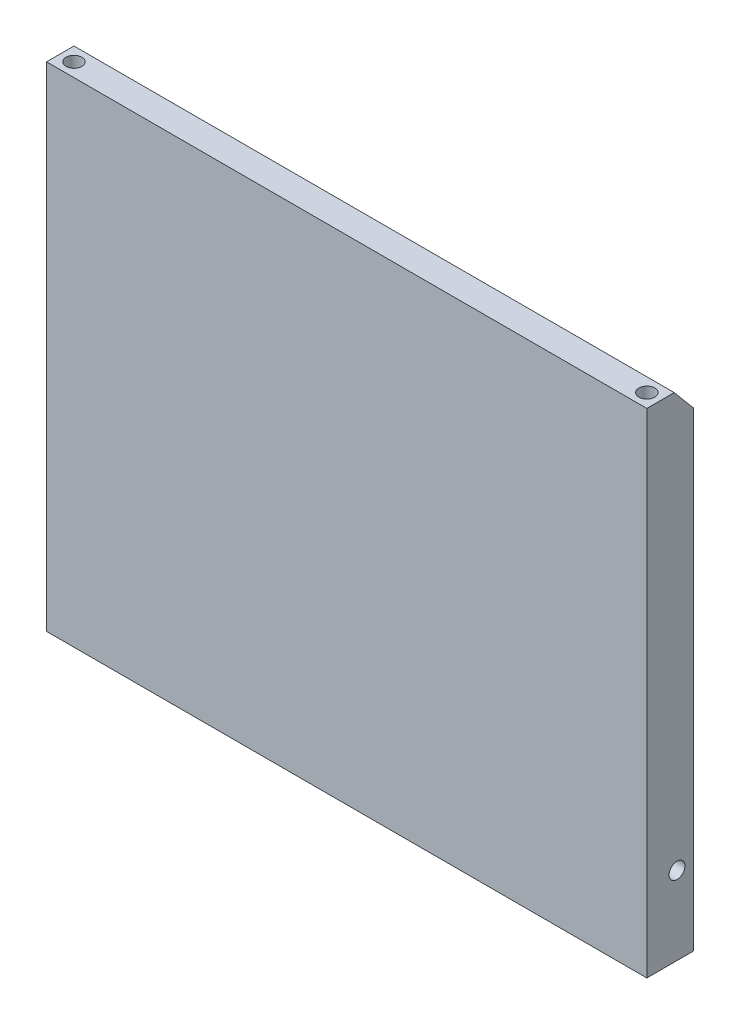
ISO-10303-21;
HEADER;
FILE_DESCRIPTION(('STEP AP214'),'2;1');
FILE_NAME('part.step','',(''),(''),'','','');
FILE_SCHEMA(('AUTOMOTIVE_DESIGN { 1 0 10303 214 1 1 1 1 }'));
ENDSEC;
DATA;
#1=APPLICATION_CONTEXT('core data for automotive mechanical design processes');
#2=APPLICATION_PROTOCOL_DEFINITION('international standard','automotive_design',2000,#1);
#3=PRODUCT_CONTEXT('',#1,'mechanical');
#4=PRODUCT('Part','Part','',(#3));
#5=PRODUCT_RELATED_PRODUCT_CATEGORY('part','',(#4));
#6=PRODUCT_DEFINITION_FORMATION('','',#4);
#7=PRODUCT_DEFINITION_CONTEXT('part definition',#1,'design');
#8=PRODUCT_DEFINITION('design','',#6,#7);
#9=PRODUCT_DEFINITION_SHAPE('','',#8);
#10=(LENGTH_UNIT() NAMED_UNIT(*) SI_UNIT(.MILLI.,.METRE.));
#11=(NAMED_UNIT(*) PLANE_ANGLE_UNIT() SI_UNIT($,.RADIAN.));
#12=(NAMED_UNIT(*) SI_UNIT($,.STERADIAN.) SOLID_ANGLE_UNIT());
#13=UNCERTAINTY_MEASURE_WITH_UNIT(LENGTH_MEASURE(1.E-05),#10,'distance_accuracy_value','');
#14=(GEOMETRIC_REPRESENTATION_CONTEXT(3) GLOBAL_UNCERTAINTY_ASSIGNED_CONTEXT((#13)) GLOBAL_UNIT_ASSIGNED_CONTEXT((#10,
#11,#12)) REPRESENTATION_CONTEXT('',''));
#15=CARTESIAN_POINT('',(0.,0.,0.));
#16=DIRECTION('',(0.,0.,1.));
#17=DIRECTION('',(1.,0.,0.));
#18=AXIS2_PLACEMENT_3D('',#15,#16,#17);
#19=CARTESIAN_POINT('',(-5.30656779661017,-80.8019491525424,5.));
#20=DIRECTION('',(1.,0.,0.));
#21=DIRECTION('',(0.,0.,-1.));
#22=AXIS2_PLACEMENT_3D('',#19,#20,#21);
#23=PLANE('',#22);
#24=CARTESIAN_POINT('',(-5.30656779661018,-66.5519491525424,-0.500000000000002));
#25=DIRECTION('',(1.,0.,0.));
#26=DIRECTION('',(0.,0.,-1.));
#27=AXIS2_PLACEMENT_3D('',#24,#25,#26);
#28=CIRCLE('',#27,1.44999999999999);
#29=CARTESIAN_POINT('',(-5.30656779661018,-66.5519491525424,-1.94999999999999));
#30=VERTEX_POINT('',#29);
#31=EDGE_CURVE('E250',#30,#30,#28,.T.);
#32=ORIENTED_EDGE('',*,*,#31,.T.);
#33=EDGE_LOOP('',(#32));
#34=FACE_BOUND('',#33,.T.);
#35=DIRECTION('',(0.,0.,-1.));
#36=VECTOR('',#35,1.);
#37=CARTESIAN_POINT('',(-5.30656779661017,9.19805084745762,5.));
#38=LINE('',#37,#36);
#39=CARTESIAN_POINT('',(-5.30656779661017,9.19805084745762,5.));
#40=VERTEX_POINT('',#39);
#41=CARTESIAN_POINT('',(-5.30656779661017,9.19805084745762,0.));
#42=VERTEX_POINT('',#41);
#43=EDGE_CURVE('E184',#40,#42,#38,.T.);
#44=ORIENTED_EDGE('',*,*,#43,.T.);
#45=DIRECTION('',(0.,-0.766044443118976,-0.642787609686541));
#46=VECTOR('',#45,1.);
#47=CARTESIAN_POINT('',(-5.30656779661017,5.02691327337788,-3.5));
#48=LINE('',#47,#46);
#49=CARTESIAN_POINT('',(-5.30656779661017,5.02691327337784,-3.5));
#50=VERTEX_POINT('',#49);
#51=EDGE_CURVE('E11',#42,#50,#48,.T.);
#52=ORIENTED_EDGE('',*,*,#51,.T.);
#53=DIRECTION('',(0.,1.,0.));
#54=VECTOR('',#53,1.);
#55=CARTESIAN_POINT('',(-5.30656779661017,-80.8019491525424,-3.5));
#56=LINE('',#55,#54);
#57=CARTESIAN_POINT('',(-5.30656779661017,-80.8019491525424,-3.5));
#58=VERTEX_POINT('',#57);
#59=EDGE_CURVE('E160',#58,#50,#56,.T.);
#60=ORIENTED_EDGE('',*,*,#59,.F.);
#61=DIRECTION('',(0.,0.,-1.));
#62=VECTOR('',#61,1.);
#63=CARTESIAN_POINT('',(-5.30656779661017,-80.8019491525424,5.));
#64=LINE('',#63,#62);
#65=CARTESIAN_POINT('',(-5.30656779661017,-80.8019491525424,5.));
#66=VERTEX_POINT('',#65);
#67=EDGE_CURVE('E191',#66,#58,#64,.T.);
#68=ORIENTED_EDGE('',*,*,#67,.F.);
#69=DIRECTION('',(0.,-1.,0.));
#70=VECTOR('',#69,1.);
#71=CARTESIAN_POINT('',(-5.30656779661017,-80.8019491525424,5.));
#72=LINE('',#71,#70);
#73=EDGE_CURVE('E167',#40,#66,#72,.T.);
#74=ORIENTED_EDGE('',*,*,#73,.F.);
#75=EDGE_LOOP('',(#44,#52,#60,#68,#74));
#76=FACE_BOUND('',#75,.T.);
#77=ADVANCED_FACE('F41',(#34,#76),#23,.F.);
#78=CARTESIAN_POINT('',(-5.30656779661017,-80.8019491525424,5.));
#79=DIRECTION('',(0.,1.,0.));
#80=DIRECTION('',(0.,0.,1.));
#81=AXIS2_PLACEMENT_3D('',#78,#79,#80);
#82=PLANE('',#81);
#83=ORIENTED_EDGE('',*,*,#67,.T.);
#84=DIRECTION('',(-1.,0.,0.));
#85=VECTOR('',#84,1.);
#86=CARTESIAN_POINT('',(104.21343220339,-80.8019491525424,-3.5));
#87=LINE('',#86,#85);
#88=CARTESIAN_POINT('',(104.21343220339,-80.8019491525424,-3.5));
#89=VERTEX_POINT('',#88);
#90=EDGE_CURVE('E157',#89,#58,#87,.T.);
#91=ORIENTED_EDGE('',*,*,#90,.F.);
#92=DIRECTION('',(0.,0.,-1.));
#93=VECTOR('',#92,1.);
#94=CARTESIAN_POINT('',(104.21343220339,-80.8019491525424,5.));
#95=LINE('',#94,#93);
#96=CARTESIAN_POINT('',(104.21343220339,-80.8019491525424,5.));
#97=VERTEX_POINT('',#96);
#98=EDGE_CURVE('E188',#97,#89,#95,.T.);
#99=ORIENTED_EDGE('',*,*,#98,.F.);
#100=DIRECTION('',(1.,0.,0.));
#101=VECTOR('',#100,1.);
#102=CARTESIAN_POINT('',(-5.30656779661017,-80.8019491525424,5.));
#103=LINE('',#102,#101);
#104=EDGE_CURVE('E178',#66,#97,#103,.T.);
#105=ORIENTED_EDGE('',*,*,#104,.F.);
#106=EDGE_LOOP('',(#83,#91,#99,#105));
#107=FACE_BOUND('',#106,.T.);
#108=ADVANCED_FACE('F216',(#107),#82,.F.);
#109=CARTESIAN_POINT('',(104.21343220339,-80.8019491525424,5.));
#110=DIRECTION('',(-1.,0.,0.));
#111=DIRECTION('',(0.,0.,1.));
#112=AXIS2_PLACEMENT_3D('',#109,#110,#111);
#113=PLANE('',#112);
#114=CARTESIAN_POINT('',(104.21343220339,-66.5519491525424,-0.500000000000002));
#115=DIRECTION('',(1.,0.,0.));
#116=DIRECTION('',(0.,0.,-1.));
#117=AXIS2_PLACEMENT_3D('',#114,#115,#116);
#118=CIRCLE('',#117,1.44999999999999);
#119=CARTESIAN_POINT('',(104.21343220339,-66.5519491525424,-1.94999999999999));
#120=VERTEX_POINT('',#119);
#121=EDGE_CURVE('E139',#120,#120,#118,.T.);
#122=ORIENTED_EDGE('',*,*,#121,.F.);
#123=EDGE_LOOP('',(#122));
#124=FACE_BOUND('',#123,.T.);
#125=DIRECTION('',(0.,-1.,0.));
#126=VECTOR('',#125,1.);
#127=CARTESIAN_POINT('',(104.21343220339,9.19805084745762,-3.5));
#128=LINE('',#127,#126);
#129=CARTESIAN_POINT('',(104.21343220339,5.02691327337788,-3.5));
#130=VERTEX_POINT('',#129);
#131=EDGE_CURVE('E152',#130,#89,#128,.T.);
#132=ORIENTED_EDGE('',*,*,#131,.F.);
#133=DIRECTION('',(0.,0.766044443118976,0.642787609686541));
#134=VECTOR('',#133,1.);
#135=CARTESIAN_POINT('',(104.21343220339,5.02691327337788,-3.5));
#136=LINE('',#135,#134);
#137=CARTESIAN_POINT('',(104.21343220339,9.19805084745762,0.));
#138=VERTEX_POINT('',#137);
#139=EDGE_CURVE('E196',#130,#138,#136,.T.);
#140=ORIENTED_EDGE('',*,*,#139,.T.);
#141=DIRECTION('',(0.,0.,-1.));
#142=VECTOR('',#141,1.);
#143=CARTESIAN_POINT('',(104.21343220339,9.19805084745762,5.));
#144=LINE('',#143,#142);
#145=CARTESIAN_POINT('',(104.21343220339,9.19805084745762,5.));
#146=VERTEX_POINT('',#145);
#147=EDGE_CURVE('E186',#146,#138,#144,.T.);
#148=ORIENTED_EDGE('',*,*,#147,.F.);
#149=DIRECTION('',(0.,1.,0.));
#150=VECTOR('',#149,1.);
#151=CARTESIAN_POINT('',(104.21343220339,-80.8019491525424,5.));
#152=LINE('',#151,#150);
#153=EDGE_CURVE('E180',#97,#146,#152,.T.);
#154=ORIENTED_EDGE('',*,*,#153,.F.);
#155=ORIENTED_EDGE('',*,*,#98,.T.);
#156=EDGE_LOOP('',(#132,#140,#148,#154,#155));
#157=FACE_BOUND('',#156,.T.);
#158=ADVANCED_FACE('F200',(#124,#157),#113,.F.);
#159=CARTESIAN_POINT('',(-5.30656779661017,9.19805084745762,5.));
#160=DIRECTION('',(0.,-1.,0.));
#161=DIRECTION('',(0.,0.,-1.));
#162=AXIS2_PLACEMENT_3D('',#159,#160,#161);
#163=PLANE('',#162);
#164=CARTESIAN_POINT('',(101.71343220339,9.19805084745762,2.5));
#165=DIRECTION('',(0.,1.,0.));
#166=DIRECTION('',(0.,0.,1.));
#167=AXIS2_PLACEMENT_3D('',#164,#165,#166);
#168=CIRCLE('',#167,1.45);
#169=CARTESIAN_POINT('',(101.71343220339,9.19805084745762,3.95));
#170=VERTEX_POINT('',#169);
#171=EDGE_CURVE('E168',#170,#170,#168,.T.);
#172=ORIENTED_EDGE('',*,*,#171,.F.);
#173=EDGE_LOOP('',(#172));
#174=FACE_BOUND('',#173,.T.);
#175=CARTESIAN_POINT('',(-2.80656779661017,9.19805084745762,2.5));
#176=DIRECTION('',(0.,1.,0.));
#177=DIRECTION('',(0.,0.,1.));
#178=AXIS2_PLACEMENT_3D('',#175,#176,#177);
#179=CIRCLE('',#178,1.45);
#180=CARTESIAN_POINT('',(-2.80656779661017,9.19805084745762,3.95));
#181=VERTEX_POINT('',#180);
#182=EDGE_CURVE('E171',#181,#181,#179,.T.);
#183=ORIENTED_EDGE('',*,*,#182,.F.);
#184=EDGE_LOOP('',(#183));
#185=FACE_BOUND('',#184,.T.);
#186=ORIENTED_EDGE('',*,*,#147,.T.);
#187=DIRECTION('',(-1.,0.,0.));
#188=VECTOR('',#187,1.);
#189=CARTESIAN_POINT('',(-5.30656779661017,9.19805084745762,0.));
#190=LINE('',#189,#188);
#191=EDGE_CURVE('E50',#138,#42,#190,.T.);
#192=ORIENTED_EDGE('',*,*,#191,.T.);
#193=ORIENTED_EDGE('',*,*,#43,.F.);
#194=DIRECTION('',(-1.,0.,0.));
#195=VECTOR('',#194,1.);
#196=CARTESIAN_POINT('',(-5.30656779661017,9.19805084745762,5.));
#197=LINE('',#196,#195);
#198=EDGE_CURVE('E182',#146,#40,#197,.T.);
#199=ORIENTED_EDGE('',*,*,#198,.F.);
#200=EDGE_LOOP('',(#186,#192,#193,#199));
#201=FACE_BOUND('',#200,.T.);
#202=ADVANCED_FACE('F205',(#174,#185,#201),#163,.F.);
#203=CARTESIAN_POINT('',(0.,0.,5.));
#204=DIRECTION('',(0.,0.,-1.));
#205=DIRECTION('',(-1.,0.,0.));
#206=AXIS2_PLACEMENT_3D('',#203,#204,#205);
#207=PLANE('',#206);
#208=ORIENTED_EDGE('',*,*,#73,.T.);
#209=ORIENTED_EDGE('',*,*,#104,.T.);
#210=ORIENTED_EDGE('',*,*,#153,.T.);
#211=ORIENTED_EDGE('',*,*,#198,.T.);
#212=EDGE_LOOP('',(#208,#209,#210,#211));
#213=FACE_BOUND('',#212,.T.);
#214=ADVANCED_FACE('F218',(#213),#207,.F.);
#215=CARTESIAN_POINT('',(-2.80656779661017,2.19805084745762,2.5));
#216=DIRECTION('',(0.,1.,0.));
#217=DIRECTION('',(0.,0.,1.));
#218=AXIS2_PLACEMENT_3D('',#215,#216,#217);
#219=CYLINDRICAL_SURFACE('',#218,1.45);
#220=CARTESIAN_POINT('',(-2.80656779661017,2.19805084745762,2.5));
#221=DIRECTION('',(0.,1.,0.));
#222=DIRECTION('',(0.,0.,1.));
#223=AXIS2_PLACEMENT_3D('',#220,#221,#222);
#224=CIRCLE('',#223,1.45);
#225=CARTESIAN_POINT('',(-2.80656779661017,2.19805084745762,3.95));
#226=VERTEX_POINT('',#225);
#227=EDGE_CURVE('E163',#226,#226,#224,.T.);
#228=ORIENTED_EDGE('',*,*,#227,.F.);
#229=EDGE_LOOP('',(#228));
#230=FACE_BOUND('',#229,.T.);
#231=ORIENTED_EDGE('',*,*,#182,.T.);
#232=EDGE_LOOP('',(#231));
#233=FACE_BOUND('',#232,.T.);
#234=ADVANCED_FACE('F220',(#230,#233),#219,.F.);
#235=CARTESIAN_POINT('',(-2.80656779661017,2.19805084745762,2.5));
#236=DIRECTION('',(0.,1.,0.));
#237=DIRECTION('',(0.,0.,1.));
#238=AXIS2_PLACEMENT_3D('',#235,#236,#237);
#239=PLANE('',#238);
#240=ORIENTED_EDGE('',*,*,#227,.T.);
#241=EDGE_LOOP('',(#240));
#242=FACE_BOUND('',#241,.T.);
#243=ADVANCED_FACE('F226',(#242),#239,.T.);
#244=CARTESIAN_POINT('',(101.71343220339,2.19805084745762,2.5));
#245=DIRECTION('',(0.,1.,0.));
#246=DIRECTION('',(0.,0.,1.));
#247=AXIS2_PLACEMENT_3D('',#244,#245,#246);
#248=CYLINDRICAL_SURFACE('',#247,1.45);
#249=CARTESIAN_POINT('',(101.71343220339,2.19805084745762,2.5));
#250=DIRECTION('',(0.,1.,0.));
#251=DIRECTION('',(0.,0.,1.));
#252=AXIS2_PLACEMENT_3D('',#249,#250,#251);
#253=CIRCLE('',#252,1.45);
#254=CARTESIAN_POINT('',(101.71343220339,2.19805084745762,3.95));
#255=VERTEX_POINT('',#254);
#256=EDGE_CURVE('E164',#255,#255,#253,.T.);
#257=ORIENTED_EDGE('',*,*,#256,.F.);
#258=EDGE_LOOP('',(#257));
#259=FACE_BOUND('',#258,.T.);
#260=ORIENTED_EDGE('',*,*,#171,.T.);
#261=EDGE_LOOP('',(#260));
#262=FACE_BOUND('',#261,.T.);
#263=ADVANCED_FACE('F295',(#259,#262),#248,.F.);
#264=CARTESIAN_POINT('',(101.71343220339,2.19805084745762,2.5));
#265=DIRECTION('',(0.,1.,0.));
#266=DIRECTION('',(0.,0.,1.));
#267=AXIS2_PLACEMENT_3D('',#264,#265,#266);
#268=PLANE('',#267);
#269=ORIENTED_EDGE('',*,*,#256,.T.);
#270=EDGE_LOOP('',(#269));
#271=FACE_BOUND('',#270,.T.);
#272=ADVANCED_FACE('F291',(#271),#268,.T.);
#273=CARTESIAN_POINT('',(0.,0.,-3.5));
#274=DIRECTION('',(0.,0.,-1.));
#275=DIRECTION('',(-1.,0.,0.));
#276=AXIS2_PLACEMENT_3D('',#273,#274,#275);
#277=PLANE('',#276);
#278=DIRECTION('',(0.,-1.,0.));
#279=VECTOR('',#278,1.);
#280=CARTESIAN_POINT('',(99.5534322033898,3.79805084745764,-3.5));
#281=LINE('',#280,#279);
#282=CARTESIAN_POINT('',(99.5534322033898,3.79805084745764,-3.5));
#283=VERTEX_POINT('',#282);
#284=CARTESIAN_POINT('',(99.5534322033898,-75.4019491525424,-3.5));
#285=VERTEX_POINT('',#284);
#286=EDGE_CURVE('E57',#283,#285,#281,.T.);
#287=ORIENTED_EDGE('',*,*,#286,.F.);
#288=DIRECTION('',(1.,0.,0.));
#289=VECTOR('',#288,1.);
#290=CARTESIAN_POINT('',(99.5534322033898,3.79805084745764,-3.5));
#291=LINE('',#290,#289);
#292=CARTESIAN_POINT('',(-0.646567796610178,3.79805084745765,-3.5));
#293=VERTEX_POINT('',#292);
#294=EDGE_CURVE('E133',#293,#283,#291,.T.);
#295=ORIENTED_EDGE('',*,*,#294,.F.);
#296=DIRECTION('',(0.,1.,0.));
#297=VECTOR('',#296,1.);
#298=CARTESIAN_POINT('',(-0.646567796610178,3.79805084745765,-3.5));
#299=LINE('',#298,#297);
#300=CARTESIAN_POINT('',(-0.646567796610178,-75.4019491525424,-3.5));
#301=VERTEX_POINT('',#300);
#302=EDGE_CURVE('E136',#301,#293,#299,.T.);
#303=ORIENTED_EDGE('',*,*,#302,.F.);
#304=DIRECTION('',(-1.,0.,0.));
#305=VECTOR('',#304,1.);
#306=CARTESIAN_POINT('',(99.5534322033898,-75.4019491525424,-3.5));
#307=LINE('',#306,#305);
#308=EDGE_CURVE('E145',#285,#301,#307,.T.);
#309=ORIENTED_EDGE('',*,*,#308,.F.);
#310=EDGE_LOOP('',(#287,#295,#303,#309));
#311=FACE_BOUND('',#310,.T.);
#312=ORIENTED_EDGE('',*,*,#59,.T.);
#313=DIRECTION('',(1.,0.,0.));
#314=VECTOR('',#313,1.);
#315=CARTESIAN_POINT('',(104.21343220339,5.02691327337788,-3.5));
#316=LINE('',#315,#314);
#317=EDGE_CURVE('E193',#50,#130,#316,.T.);
#318=ORIENTED_EDGE('',*,*,#317,.T.);
#319=ORIENTED_EDGE('',*,*,#131,.T.);
#320=ORIENTED_EDGE('',*,*,#90,.T.);
#321=EDGE_LOOP('',(#312,#318,#319,#320));
#322=FACE_BOUND('',#321,.T.);
#323=ADVANCED_FACE('F212',(#311,#322),#277,.T.);
#324=CARTESIAN_POINT('',(0.,5.02691327337788,-3.5));
#325=DIRECTION('',(0.,0.642787609686542,-0.766044443118976));
#326=DIRECTION('',(-1.,0.,0.));
#327=AXIS2_PLACEMENT_3D('',#324,#325,#326);
#328=PLANE('',#327);
#329=ORIENTED_EDGE('',*,*,#51,.F.);
#330=ORIENTED_EDGE('',*,*,#191,.F.);
#331=ORIENTED_EDGE('',*,*,#139,.F.);
#332=ORIENTED_EDGE('',*,*,#317,.F.);
#333=EDGE_LOOP('',(#329,#330,#331,#332));
#334=FACE_BOUND('',#333,.T.);
#335=ADVANCED_FACE('F44',(#334),#328,.T.);
#336=CARTESIAN_POINT('',(99.5534322033898,3.79805084745764,3.));
#337=DIRECTION('',(1.,0.,0.));
#338=DIRECTION('',(0.,0.,-1.));
#339=AXIS2_PLACEMENT_3D('',#336,#337,#338);
#340=PLANE('',#339);
#341=ORIENTED_EDGE('',*,*,#286,.T.);
#342=DIRECTION('',(0.,0.,-1.));
#343=VECTOR('',#342,1.);
#344=CARTESIAN_POINT('',(99.5534322033898,-75.4019491525424,3.));
#345=LINE('',#344,#343);
#346=CARTESIAN_POINT('',(99.5534322033898,-75.4019491525424,3.));
#347=VERTEX_POINT('',#346);
#348=EDGE_CURVE('E111',#347,#285,#345,.T.);
#349=ORIENTED_EDGE('',*,*,#348,.F.);
#350=DIRECTION('',(0.,-1.,0.));
#351=VECTOR('',#350,1.);
#352=CARTESIAN_POINT('',(99.5534322033898,3.79805084745764,3.));
#353=LINE('',#352,#351);
#354=CARTESIAN_POINT('',(99.5534322033898,3.79805084745764,3.));
#355=VERTEX_POINT('',#354);
#356=EDGE_CURVE('E115',#355,#347,#353,.T.);
#357=ORIENTED_EDGE('',*,*,#356,.F.);
#358=DIRECTION('',(0.,0.,-1.));
#359=VECTOR('',#358,1.);
#360=CARTESIAN_POINT('',(99.5534322033898,3.79805084745764,3.));
#361=LINE('',#360,#359);
#362=EDGE_CURVE('E150',#355,#283,#361,.T.);
#363=ORIENTED_EDGE('',*,*,#362,.T.);
#364=EDGE_LOOP('',(#341,#349,#357,#363));
#365=FACE_BOUND('',#364,.T.);
#366=ADVANCED_FACE('F113',(#365),#340,.F.);
#367=CARTESIAN_POINT('',(99.5534322033898,3.79805084745764,3.));
#368=DIRECTION('',(0.,1.,0.));
#369=DIRECTION('',(-1.,0.,0.));
#370=AXIS2_PLACEMENT_3D('',#367,#368,#369);
#371=PLANE('',#370);
#372=ORIENTED_EDGE('',*,*,#294,.T.);
#373=ORIENTED_EDGE('',*,*,#362,.F.);
#374=DIRECTION('',(1.,0.,0.));
#375=VECTOR('',#374,1.);
#376=CARTESIAN_POINT('',(99.5534322033898,3.79805084745764,3.));
#377=LINE('',#376,#375);
#378=CARTESIAN_POINT('',(-0.646567796610178,3.79805084745765,3.));
#379=VERTEX_POINT('',#378);
#380=EDGE_CURVE('E121',#379,#355,#377,.T.);
#381=ORIENTED_EDGE('',*,*,#380,.F.);
#382=DIRECTION('',(0.,0.,-1.));
#383=VECTOR('',#382,1.);
#384=CARTESIAN_POINT('',(-0.646567796610178,3.79805084745765,3.));
#385=LINE('',#384,#383);
#386=EDGE_CURVE('E153',#379,#293,#385,.T.);
#387=ORIENTED_EDGE('',*,*,#386,.T.);
#388=EDGE_LOOP('',(#372,#373,#381,#387));
#389=FACE_BOUND('',#388,.T.);
#390=ADVANCED_FACE('F277',(#389),#371,.F.);
#391=CARTESIAN_POINT('',(-0.646567796610178,3.79805084745765,3.));
#392=DIRECTION('',(-1.,0.,0.));
#393=DIRECTION('',(0.,0.,1.));
#394=AXIS2_PLACEMENT_3D('',#391,#392,#393);
#395=PLANE('',#394);
#396=ORIENTED_EDGE('',*,*,#302,.T.);
#397=ORIENTED_EDGE('',*,*,#386,.F.);
#398=DIRECTION('',(0.,1.,0.));
#399=VECTOR('',#398,1.);
#400=CARTESIAN_POINT('',(-0.646567796610178,3.79805084745765,3.));
#401=LINE('',#400,#399);
#402=CARTESIAN_POINT('',(-0.646567796610178,-75.4019491525424,3.));
#403=VERTEX_POINT('',#402);
#404=EDGE_CURVE('E129',#403,#379,#401,.T.);
#405=ORIENTED_EDGE('',*,*,#404,.F.);
#406=DIRECTION('',(0.,0.,-1.));
#407=VECTOR('',#406,1.);
#408=CARTESIAN_POINT('',(-0.646567796610178,-75.4019491525424,3.));
#409=LINE('',#408,#407);
#410=EDGE_CURVE('E120',#403,#301,#409,.T.);
#411=ORIENTED_EDGE('',*,*,#410,.T.);
#412=EDGE_LOOP('',(#396,#397,#405,#411));
#413=FACE_BOUND('',#412,.T.);
#414=ADVANCED_FACE('F280',(#413),#395,.F.);
#415=CARTESIAN_POINT('',(99.5534322033898,-75.4019491525424,3.));
#416=DIRECTION('',(0.,-1.,0.));
#417=DIRECTION('',(0.,0.,-1.));
#418=AXIS2_PLACEMENT_3D('',#415,#416,#417);
#419=PLANE('',#418);
#420=ORIENTED_EDGE('',*,*,#308,.T.);
#421=ORIENTED_EDGE('',*,*,#410,.F.);
#422=DIRECTION('',(-1.,0.,0.));
#423=VECTOR('',#422,1.);
#424=CARTESIAN_POINT('',(99.5534322033898,-75.4019491525424,3.));
#425=LINE('',#424,#423);
#426=EDGE_CURVE('E124',#347,#403,#425,.T.);
#427=ORIENTED_EDGE('',*,*,#426,.F.);
#428=ORIENTED_EDGE('',*,*,#348,.T.);
#429=EDGE_LOOP('',(#420,#421,#427,#428));
#430=FACE_BOUND('',#429,.T.);
#431=ADVANCED_FACE('F125',(#430),#419,.F.);
#432=CARTESIAN_POINT('',(0.,0.,3.));
#433=DIRECTION('',(0.,0.,-1.));
#434=DIRECTION('',(-1.,0.,0.));
#435=AXIS2_PLACEMENT_3D('',#432,#433,#434);
#436=PLANE('',#435);
#437=ORIENTED_EDGE('',*,*,#356,.T.);
#438=ORIENTED_EDGE('',*,*,#426,.T.);
#439=ORIENTED_EDGE('',*,*,#404,.T.);
#440=ORIENTED_EDGE('',*,*,#380,.T.);
#441=EDGE_LOOP('',(#437,#438,#439,#440));
#442=FACE_BOUND('',#441,.T.);
#443=ADVANCED_FACE('F131',(#442),#436,.T.);
#444=CARTESIAN_POINT('',(101.21343220339,-66.5519491525424,-0.500000000000002));
#445=DIRECTION('',(1.,0.,0.));
#446=DIRECTION('',(0.,0.,-1.));
#447=AXIS2_PLACEMENT_3D('',#444,#445,#446);
#448=CYLINDRICAL_SURFACE('',#447,1.44999999999999);
#449=CARTESIAN_POINT('',(101.21343220339,-66.5519491525424,-0.500000000000002));
#450=DIRECTION('',(1.,0.,0.));
#451=DIRECTION('',(0.,0.,-1.));
#452=AXIS2_PLACEMENT_3D('',#449,#450,#451);
#453=CIRCLE('',#452,1.44999999999999);
#454=CARTESIAN_POINT('',(101.21343220339,-66.5519491525424,-1.94999999999999));
#455=VERTEX_POINT('',#454);
#456=EDGE_CURVE('E146',#455,#455,#453,.T.);
#457=ORIENTED_EDGE('',*,*,#456,.F.);
#458=EDGE_LOOP('',(#457));
#459=FACE_BOUND('',#458,.T.);
#460=ORIENTED_EDGE('',*,*,#121,.T.);
#461=EDGE_LOOP('',(#460));
#462=FACE_BOUND('',#461,.T.);
#463=ADVANCED_FACE('F268',(#459,#462),#448,.F.);
#464=CARTESIAN_POINT('',(101.21343220339,-66.5519491525424,-0.500000000000002));
#465=DIRECTION('',(1.,0.,0.));
#466=DIRECTION('',(0.,0.,-1.));
#467=AXIS2_PLACEMENT_3D('',#464,#465,#466);
#468=PLANE('',#467);
#469=ORIENTED_EDGE('',*,*,#456,.T.);
#470=EDGE_LOOP('',(#469));
#471=FACE_BOUND('',#470,.T.);
#472=ADVANCED_FACE('F260',(#471),#468,.T.);
#473=CARTESIAN_POINT('',(-2.30656779661018,-66.5519491525424,-0.500000000000002));
#474=DIRECTION('',(-1.,0.,0.));
#475=DIRECTION('',(0.,0.,1.));
#476=AXIS2_PLACEMENT_3D('',#473,#474,#475);
#477=CYLINDRICAL_SURFACE('',#476,1.44999999999999);
#478=CARTESIAN_POINT('',(-2.30656779661018,-66.5519491525424,-0.500000000000002));
#479=DIRECTION('',(1.,0.,0.));
#480=DIRECTION('',(0.,0.,-1.));
#481=AXIS2_PLACEMENT_3D('',#478,#479,#480);
#482=CIRCLE('',#481,1.44999999999999);
#483=CARTESIAN_POINT('',(-2.30656779661018,-66.5519491525424,-1.94999999999999));
#484=VERTEX_POINT('',#483);
#485=EDGE_CURVE('E247',#484,#484,#482,.T.);
#486=ORIENTED_EDGE('',*,*,#485,.T.);
#487=EDGE_LOOP('',(#486));
#488=FACE_BOUND('',#487,.T.);
#489=ORIENTED_EDGE('',*,*,#31,.F.);
#490=EDGE_LOOP('',(#489));
#491=FACE_BOUND('',#490,.T.);
#492=ADVANCED_FACE('F257',(#488,#491),#477,.F.);
#493=CARTESIAN_POINT('',(-2.30656779661018,-66.5519491525424,-0.500000000000002));
#494=DIRECTION('',(-1.,0.,0.));
#495=DIRECTION('',(0.,0.,-1.));
#496=AXIS2_PLACEMENT_3D('',#493,#494,#495);
#497=PLANE('',#496);
#498=ORIENTED_EDGE('',*,*,#485,.F.);
#499=EDGE_LOOP('',(#498));
#500=FACE_BOUND('',#499,.T.);
#501=ADVANCED_FACE('F259',(#500),#497,.T.);
#502=CLOSED_SHELL('',(#77,#108,#158,#202,#214,#234,#243,#263,#272,#323,#335,#366,#390,#414,#431,
#443,#463,#472,#492,#501));
#503=MANIFOLD_SOLID_BREP('B2',#502);
#504=ADVANCED_BREP_SHAPE_REPRESENTATION('',(#18,#503),#14);
#505=SHAPE_DEFINITION_REPRESENTATION(#9,#504);
ENDSEC;
END-ISO-10303-21;
